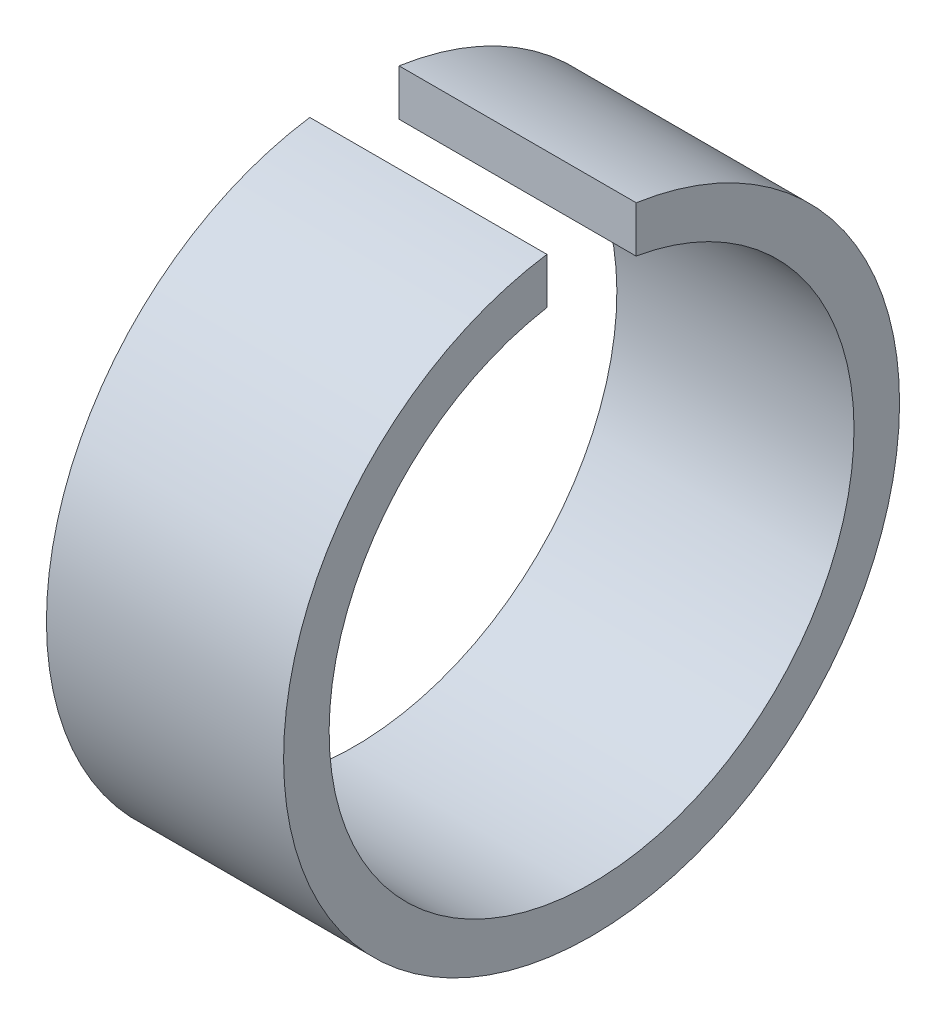
ISO-10303-21;
HEADER;
FILE_DESCRIPTION(('STEP AP214'),'2;1');
FILE_NAME('part.step','',(''),(''),'','','');
FILE_SCHEMA(('AUTOMOTIVE_DESIGN { 1 0 10303 214 1 1 1 1 }'));
ENDSEC;
DATA;
#1=APPLICATION_CONTEXT('core data for automotive mechanical design processes');
#2=APPLICATION_PROTOCOL_DEFINITION('international standard','automotive_design',2000,#1);
#3=PRODUCT_CONTEXT('',#1,'mechanical');
#4=PRODUCT('Part','Part','',(#3));
#5=PRODUCT_RELATED_PRODUCT_CATEGORY('part','',(#4));
#6=PRODUCT_DEFINITION_FORMATION('','',#4);
#7=PRODUCT_DEFINITION_CONTEXT('part definition',#1,'design');
#8=PRODUCT_DEFINITION('design','',#6,#7);
#9=PRODUCT_DEFINITION_SHAPE('','',#8);
#10=(LENGTH_UNIT() NAMED_UNIT(*) SI_UNIT(.MILLI.,.METRE.));
#11=(NAMED_UNIT(*) PLANE_ANGLE_UNIT() SI_UNIT($,.RADIAN.));
#12=(NAMED_UNIT(*) SI_UNIT($,.STERADIAN.) SOLID_ANGLE_UNIT());
#13=UNCERTAINTY_MEASURE_WITH_UNIT(LENGTH_MEASURE(1.E-05),#10,'distance_accuracy_value','');
#14=(GEOMETRIC_REPRESENTATION_CONTEXT(3) GLOBAL_UNCERTAINTY_ASSIGNED_CONTEXT((#13)) GLOBAL_UNIT_ASSIGNED_CONTEXT((#10,
#11,#12)) REPRESENTATION_CONTEXT('',''));
#15=CARTESIAN_POINT('',(0.,0.,0.));
#16=DIRECTION('',(0.,0.,1.));
#17=DIRECTION('',(1.,0.,0.));
#18=AXIS2_PLACEMENT_3D('',#15,#16,#17);
#19=CARTESIAN_POINT('',(19.05,0.,0.));
#20=DIRECTION('',(-1.,0.,0.));
#21=DIRECTION('',(0.,0.,1.));
#22=AXIS2_PLACEMENT_3D('',#19,#20,#21);
#23=CYLINDRICAL_SURFACE('',#22,24.7396);
#24=CARTESIAN_POINT('',(0.,0.,0.));
#25=DIRECTION('',(1.,0.,0.));
#26=DIRECTION('',(0.,0.,-1.));
#27=AXIS2_PLACEMENT_3D('',#24,#25,#26);
#28=CIRCLE('',#27,24.7396);
#29=CARTESIAN_POINT('',(0.,24.4781433730877,3.587242));
#30=VERTEX_POINT('',#29);
#31=CARTESIAN_POINT('',(0.,24.4781433730877,-3.587242));
#32=VERTEX_POINT('',#31);
#33=EDGE_CURVE('E95',#30,#32,#28,.T.);
#34=ORIENTED_EDGE('',*,*,#33,.T.);
#35=DIRECTION('',(-1.,0.,0.));
#36=VECTOR('',#35,1.);
#37=CARTESIAN_POINT('',(19.05,24.4781433730877,-3.587242));
#38=LINE('',#37,#36);
#39=CARTESIAN_POINT('',(19.05,24.4781433730877,-3.587242));
#40=VERTEX_POINT('',#39);
#41=EDGE_CURVE('E11',#40,#32,#38,.T.);
#42=ORIENTED_EDGE('',*,*,#41,.F.);
#43=CARTESIAN_POINT('',(19.05,0.,0.));
#44=DIRECTION('',(1.,0.,0.));
#45=DIRECTION('',(0.,0.,-1.));
#46=AXIS2_PLACEMENT_3D('',#43,#44,#45);
#47=CIRCLE('',#46,24.7396);
#48=CARTESIAN_POINT('',(19.05,24.4781433730877,3.587242));
#49=VERTEX_POINT('',#48);
#50=EDGE_CURVE('E83',#49,#40,#47,.T.);
#51=ORIENTED_EDGE('',*,*,#50,.F.);
#52=DIRECTION('',(-1.,0.,0.));
#53=VECTOR('',#52,1.);
#54=CARTESIAN_POINT('',(19.05,24.4781433730877,3.587242));
#55=LINE('',#54,#53);
#56=EDGE_CURVE('E91',#49,#30,#55,.T.);
#57=ORIENTED_EDGE('',*,*,#56,.T.);
#58=EDGE_LOOP('',(#34,#42,#51,#57));
#59=FACE_BOUND('',#58,.T.);
#60=ADVANCED_FACE('F32',(#59),#23,.T.);
#61=CARTESIAN_POINT('',(19.05,20.7773369763321,-3.57113317757009));
#62=DIRECTION('',(0.,-0.00435274588836517,-0.999990526756744));
#63=DIRECTION('',(0.,0.999990526756745,-0.00435274588836517));
#64=AXIS2_PLACEMENT_3D('',#61,#62,#63);
#65=PLANE('',#64);
#66=DIRECTION('',(0.,-0.999990526756744,0.00435274588836517));
#67=VECTOR('',#66,1.);
#68=CARTESIAN_POINT('',(0.,20.7773369763321,-3.57113317757009));
#69=LINE('',#68,#67);
#70=CARTESIAN_POINT('',(0.,20.7773369763321,-3.57113317757009));
#71=VERTEX_POINT('',#70);
#72=EDGE_CURVE('E87',#32,#71,#69,.T.);
#73=ORIENTED_EDGE('',*,*,#72,.T.);
#74=DIRECTION('',(-1.,0.,0.));
#75=VECTOR('',#74,1.);
#76=CARTESIAN_POINT('',(19.05,20.7773369763321,-3.57113317757009));
#77=LINE('',#76,#75);
#78=CARTESIAN_POINT('',(19.05,20.7773369763321,-3.57113317757009));
#79=VERTEX_POINT('',#78);
#80=EDGE_CURVE('E40',#79,#71,#77,.T.);
#81=ORIENTED_EDGE('',*,*,#80,.F.);
#82=DIRECTION('',(0.,-0.999990526756744,0.00435274588836517));
#83=VECTOR('',#82,1.);
#84=CARTESIAN_POINT('',(19.05,20.7773369763321,-3.57113317757009));
#85=LINE('',#84,#83);
#86=EDGE_CURVE('E78',#40,#79,#85,.T.);
#87=ORIENTED_EDGE('',*,*,#86,.F.);
#88=ORIENTED_EDGE('',*,*,#41,.T.);
#89=EDGE_LOOP('',(#73,#81,#87,#88));
#90=FACE_BOUND('',#89,.T.);
#91=ADVANCED_FACE('F86',(#90),#65,.F.);
#92=CARTESIAN_POINT('',(19.05,0.,0.));
#93=DIRECTION('',(-1.,0.,0.));
#94=DIRECTION('',(0.,0.,1.));
#95=AXIS2_PLACEMENT_3D('',#92,#93,#94);
#96=CYLINDRICAL_SURFACE('',#95,21.082);
#97=CARTESIAN_POINT('',(0.,0.,0.));
#98=DIRECTION('',(-1.,0.,0.));
#99=DIRECTION('',(0.,0.,-1.));
#100=AXIS2_PLACEMENT_3D('',#97,#98,#99);
#101=CIRCLE('',#100,21.082);
#102=CARTESIAN_POINT('',(0.,20.7773369763321,3.57113317757009));
#103=VERTEX_POINT('',#102);
#104=EDGE_CURVE('E65',#71,#103,#101,.T.);
#105=ORIENTED_EDGE('',*,*,#104,.T.);
#106=DIRECTION('',(-1.,0.,0.));
#107=VECTOR('',#106,1.);
#108=CARTESIAN_POINT('',(19.05,20.7773369763321,3.57113317757009));
#109=LINE('',#108,#107);
#110=CARTESIAN_POINT('',(19.05,20.7773369763321,3.57113317757009));
#111=VERTEX_POINT('',#110);
#112=EDGE_CURVE('E88',#111,#103,#109,.T.);
#113=ORIENTED_EDGE('',*,*,#112,.F.);
#114=CARTESIAN_POINT('',(19.05,0.,0.));
#115=DIRECTION('',(-1.,0.,0.));
#116=DIRECTION('',(0.,0.,-1.));
#117=AXIS2_PLACEMENT_3D('',#114,#115,#116);
#118=CIRCLE('',#117,21.082);
#119=EDGE_CURVE('E81',#79,#111,#118,.T.);
#120=ORIENTED_EDGE('',*,*,#119,.F.);
#121=ORIENTED_EDGE('',*,*,#80,.T.);
#122=EDGE_LOOP('',(#105,#113,#120,#121));
#123=FACE_BOUND('',#122,.T.);
#124=ADVANCED_FACE('F89',(#123),#96,.F.);
#125=CARTESIAN_POINT('',(19.05,20.7773369763321,3.57113317757009));
#126=DIRECTION('',(0.,-0.00435274588836505,0.999990526756744));
#127=DIRECTION('',(0.,-0.999990526756745,-0.00435274588836505));
#128=AXIS2_PLACEMENT_3D('',#125,#126,#127);
#129=PLANE('',#128);
#130=DIRECTION('',(0.,0.999990526756744,0.00435274588836505));
#131=VECTOR('',#130,1.);
#132=CARTESIAN_POINT('',(0.,20.7773369763321,3.57113317757009));
#133=LINE('',#132,#131);
#134=EDGE_CURVE('E71',#103,#30,#133,.T.);
#135=ORIENTED_EDGE('',*,*,#134,.T.);
#136=ORIENTED_EDGE('',*,*,#56,.F.);
#137=DIRECTION('',(0.,0.999990526756744,0.00435274588836505));
#138=VECTOR('',#137,1.);
#139=CARTESIAN_POINT('',(19.05,20.7773369763321,3.57113317757009));
#140=LINE('',#139,#138);
#141=EDGE_CURVE('E48',#111,#49,#140,.T.);
#142=ORIENTED_EDGE('',*,*,#141,.F.);
#143=ORIENTED_EDGE('',*,*,#112,.T.);
#144=EDGE_LOOP('',(#135,#136,#142,#143));
#145=FACE_BOUND('',#144,.T.);
#146=ADVANCED_FACE('F102',(#145),#129,.F.);
#147=CARTESIAN_POINT('',(19.05,0.,0.));
#148=DIRECTION('',(1.,0.,0.));
#149=DIRECTION('',(0.,0.,-1.));
#150=AXIS2_PLACEMENT_3D('',#147,#148,#149);
#151=PLANE('',#150);
#152=ORIENTED_EDGE('',*,*,#50,.T.);
#153=ORIENTED_EDGE('',*,*,#86,.T.);
#154=ORIENTED_EDGE('',*,*,#119,.T.);
#155=ORIENTED_EDGE('',*,*,#141,.T.);
#156=EDGE_LOOP('',(#152,#153,#154,#155));
#157=FACE_BOUND('',#156,.T.);
#158=ADVANCED_FACE('F79',(#157),#151,.T.);
#159=CARTESIAN_POINT('',(0.,0.,0.));
#160=DIRECTION('',(1.,0.,0.));
#161=DIRECTION('',(0.,0.,-1.));
#162=AXIS2_PLACEMENT_3D('',#159,#160,#161);
#163=PLANE('',#162);
#164=ORIENTED_EDGE('',*,*,#33,.F.);
#165=ORIENTED_EDGE('',*,*,#134,.F.);
#166=ORIENTED_EDGE('',*,*,#104,.F.);
#167=ORIENTED_EDGE('',*,*,#72,.F.);
#168=EDGE_LOOP('',(#164,#165,#166,#167));
#169=FACE_BOUND('',#168,.T.);
#170=ADVANCED_FACE('F105',(#169),#163,.F.);
#171=CLOSED_SHELL('',(#60,#91,#124,#146,#158,#170));
#172=MANIFOLD_SOLID_BREP('B2',#171);
#173=ADVANCED_BREP_SHAPE_REPRESENTATION('',(#18,#172),#14);
#174=SHAPE_DEFINITION_REPRESENTATION(#9,#173);
ENDSEC;
END-ISO-10303-21;
